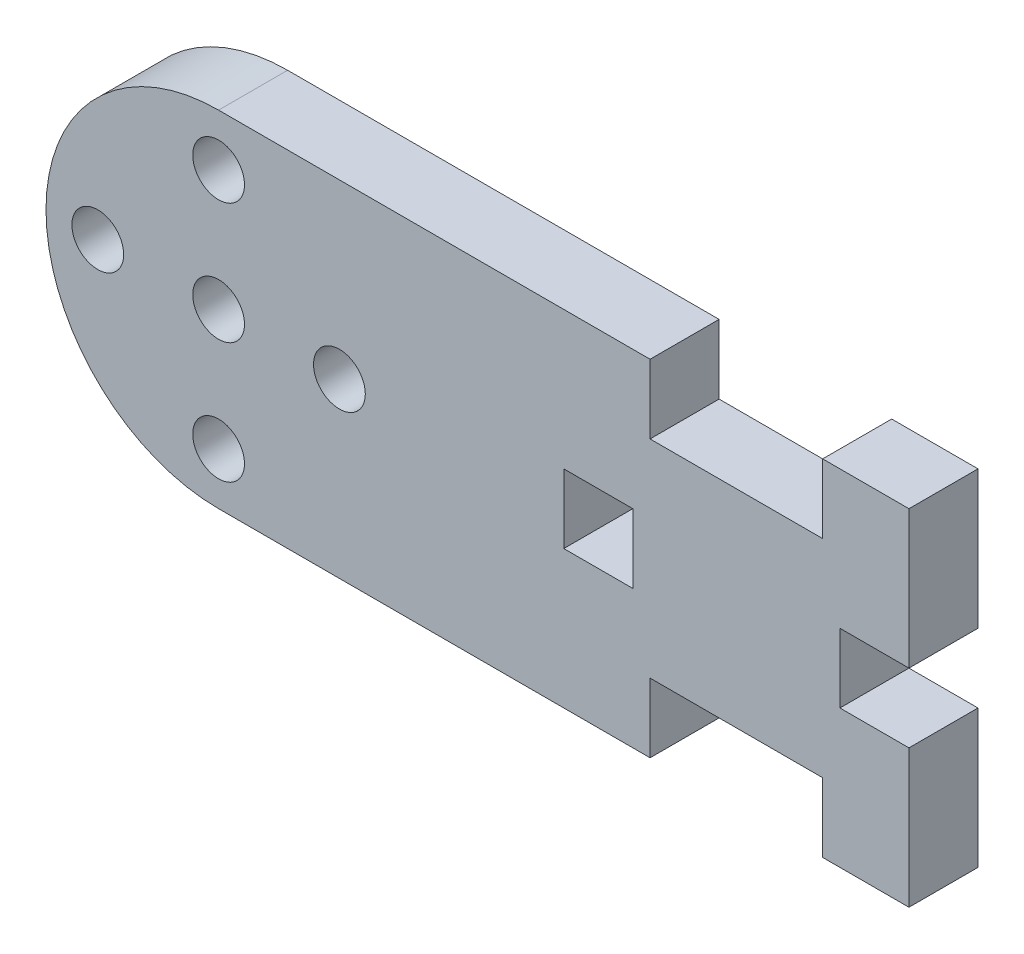
ISO-10303-21;
HEADER;
FILE_DESCRIPTION(('STEP AP214'),'2;1');
FILE_NAME('part.step','',(''),(''),'','','');
FILE_SCHEMA(('AUTOMOTIVE_DESIGN { 1 0 10303 214 1 1 1 1 }'));
ENDSEC;
DATA;
#1=APPLICATION_CONTEXT('core data for automotive mechanical design processes');
#2=APPLICATION_PROTOCOL_DEFINITION('international standard','automotive_design',2000,#1);
#3=PRODUCT_CONTEXT('',#1,'mechanical');
#4=PRODUCT('Part','Part','',(#3));
#5=PRODUCT_RELATED_PRODUCT_CATEGORY('part','',(#4));
#6=PRODUCT_DEFINITION_FORMATION('','',#4);
#7=PRODUCT_DEFINITION_CONTEXT('part definition',#1,'design');
#8=PRODUCT_DEFINITION('design','',#6,#7);
#9=PRODUCT_DEFINITION_SHAPE('','',#8);
#10=(LENGTH_UNIT() NAMED_UNIT(*) SI_UNIT(.MILLI.,.METRE.));
#11=(NAMED_UNIT(*) PLANE_ANGLE_UNIT() SI_UNIT($,.RADIAN.));
#12=(NAMED_UNIT(*) SI_UNIT($,.STERADIAN.) SOLID_ANGLE_UNIT());
#13=UNCERTAINTY_MEASURE_WITH_UNIT(LENGTH_MEASURE(1.E-05),#10,'distance_accuracy_value','');
#14=(GEOMETRIC_REPRESENTATION_CONTEXT(3) GLOBAL_UNCERTAINTY_ASSIGNED_CONTEXT((#13)) GLOBAL_UNIT_ASSIGNED_CONTEXT((#10,
#11,#12)) REPRESENTATION_CONTEXT('',''));
#15=CARTESIAN_POINT('',(0.,0.,0.));
#16=DIRECTION('',(0.,0.,1.));
#17=DIRECTION('',(1.,0.,0.));
#18=AXIS2_PLACEMENT_3D('',#15,#16,#17);
#19=CARTESIAN_POINT('',(0.,-10.,4.));
#20=DIRECTION('',(0.,1.,0.));
#21=DIRECTION('',(0.,0.,1.));
#22=AXIS2_PLACEMENT_3D('',#19,#20,#21);
#23=PLANE('',#22);
#24=DIRECTION('',(1.,0.,0.));
#25=VECTOR('',#24,1.);
#26=CARTESIAN_POINT('',(0.,-10.,0.));
#27=LINE('',#26,#25);
#28=CARTESIAN_POINT('',(0.,-10.,0.));
#29=VERTEX_POINT('',#28);
#30=CARTESIAN_POINT('',(24.9999999999998,-10.,0.));
#31=VERTEX_POINT('',#30);
#32=EDGE_CURVE('E413',#29,#31,#27,.T.);
#33=ORIENTED_EDGE('',*,*,#32,.T.);
#34=DIRECTION('',(0.,0.,1.));
#35=VECTOR('',#34,1.);
#36=CARTESIAN_POINT('',(24.9999999999998,-10.,4.));
#37=LINE('',#36,#35);
#38=CARTESIAN_POINT('',(24.9999999999998,-10.,4.));
#39=VERTEX_POINT('',#38);
#40=EDGE_CURVE('E441',#31,#39,#37,.T.);
#41=ORIENTED_EDGE('',*,*,#40,.T.);
#42=DIRECTION('',(1.,0.,0.));
#43=VECTOR('',#42,1.);
#44=CARTESIAN_POINT('',(0.,-10.,4.));
#45=LINE('',#44,#43);
#46=CARTESIAN_POINT('',(0.,-10.,4.));
#47=VERTEX_POINT('',#46);
#48=EDGE_CURVE('E311',#47,#39,#45,.T.);
#49=ORIENTED_EDGE('',*,*,#48,.F.);
#50=DIRECTION('',(0.,0.,-1.));
#51=VECTOR('',#50,1.);
#52=CARTESIAN_POINT('',(0.,-10.,4.));
#53=LINE('',#52,#51);
#54=EDGE_CURVE('E419',#47,#29,#53,.T.);
#55=ORIENTED_EDGE('',*,*,#54,.T.);
#56=EDGE_LOOP('',(#33,#41,#49,#55));
#57=FACE_BOUND('',#56,.T.);
#58=ADVANCED_FACE('F42',(#57),#23,.F.);
#59=CARTESIAN_POINT('',(0.,10.,4.));
#60=DIRECTION('',(0.,-1.,0.));
#61=DIRECTION('',(0.,0.,-1.));
#62=AXIS2_PLACEMENT_3D('',#59,#60,#61);
#63=PLANE('',#62);
#64=DIRECTION('',(-1.,0.,0.));
#65=VECTOR('',#64,1.);
#66=CARTESIAN_POINT('',(0.,10.,4.));
#67=LINE('',#66,#65);
#68=CARTESIAN_POINT('',(25.,10.,4.));
#69=VERTEX_POINT('',#68);
#70=CARTESIAN_POINT('',(0.,10.,4.));
#71=VERTEX_POINT('',#70);
#72=EDGE_CURVE('E305',#69,#71,#67,.T.);
#73=ORIENTED_EDGE('',*,*,#72,.F.);
#74=DIRECTION('',(0.,0.,-1.));
#75=VECTOR('',#74,1.);
#76=CARTESIAN_POINT('',(25.,10.,4.));
#77=LINE('',#76,#75);
#78=CARTESIAN_POINT('',(25.,10.,0.));
#79=VERTEX_POINT('',#78);
#80=EDGE_CURVE('E426',#69,#79,#77,.T.);
#81=ORIENTED_EDGE('',*,*,#80,.T.);
#82=DIRECTION('',(-1.,0.,0.));
#83=VECTOR('',#82,1.);
#84=CARTESIAN_POINT('',(0.,10.,0.));
#85=LINE('',#84,#83);
#86=CARTESIAN_POINT('',(0.,10.,0.));
#87=VERTEX_POINT('',#86);
#88=EDGE_CURVE('E406',#79,#87,#85,.T.);
#89=ORIENTED_EDGE('',*,*,#88,.T.);
#90=DIRECTION('',(0.,0.,-1.));
#91=VECTOR('',#90,1.);
#92=CARTESIAN_POINT('',(0.,10.,4.));
#93=LINE('',#92,#91);
#94=EDGE_CURVE('E415',#71,#87,#93,.T.);
#95=ORIENTED_EDGE('',*,*,#94,.F.);
#96=EDGE_LOOP('',(#73,#81,#89,#95));
#97=FACE_BOUND('',#96,.T.);
#98=ADVANCED_FACE('F536',(#97),#63,.F.);
#99=CARTESIAN_POINT('',(0.,0.,4.));
#100=DIRECTION('',(0.,0.,1.));
#101=DIRECTION('',(1.,0.,0.));
#102=AXIS2_PLACEMENT_3D('',#99,#100,#101);
#103=PLANE('',#102);
#104=DIRECTION('',(1.,0.,0.));
#105=VECTOR('',#104,1.);
#106=CARTESIAN_POINT('',(24.,-1.99999999999999,4.));
#107=LINE('',#106,#105);
#108=CARTESIAN_POINT('',(20.,-1.99999999999999,4.));
#109=VERTEX_POINT('',#108);
#110=CARTESIAN_POINT('',(24.,-1.99999999999999,4.));
#111=VERTEX_POINT('',#110);
#112=EDGE_CURVE('E58',#109,#111,#107,.T.);
#113=ORIENTED_EDGE('',*,*,#112,.F.);
#114=DIRECTION('',(0.,-1.,0.));
#115=VECTOR('',#114,1.);
#116=CARTESIAN_POINT('',(20.,-1.99999999999999,4.));
#117=LINE('',#116,#115);
#118=CARTESIAN_POINT('',(20.,1.99999999999999,4.));
#119=VERTEX_POINT('',#118);
#120=EDGE_CURVE('E273',#119,#109,#117,.T.);
#121=ORIENTED_EDGE('',*,*,#120,.F.);
#122=DIRECTION('',(-1.,0.,0.));
#123=VECTOR('',#122,1.);
#124=CARTESIAN_POINT('',(20.,1.99999999999999,4.));
#125=LINE('',#124,#123);
#126=CARTESIAN_POINT('',(24.,2.,4.));
#127=VERTEX_POINT('',#126);
#128=EDGE_CURVE('E279',#127,#119,#125,.T.);
#129=ORIENTED_EDGE('',*,*,#128,.F.);
#130=DIRECTION('',(0.,1.,0.));
#131=VECTOR('',#130,1.);
#132=CARTESIAN_POINT('',(24.,2.,4.));
#133=LINE('',#132,#131);
#134=EDGE_CURVE('E267',#111,#127,#133,.T.);
#135=ORIENTED_EDGE('',*,*,#134,.F.);
#136=EDGE_LOOP('',(#113,#121,#129,#135));
#137=FACE_BOUND('',#136,.T.);
#138=DIRECTION('',(0.,-1.,0.));
#139=VECTOR('',#138,1.);
#140=CARTESIAN_POINT('',(24.9999999999998,-10.,4.));
#141=LINE('',#140,#139);
#142=CARTESIAN_POINT('',(24.9999999999998,-6.00000000000012,4.));
#143=VERTEX_POINT('',#142);
#144=EDGE_CURVE('E241',#143,#39,#141,.T.);
#145=ORIENTED_EDGE('',*,*,#144,.F.);
#146=DIRECTION('',(-1.,0.,0.));
#147=VECTOR('',#146,1.);
#148=CARTESIAN_POINT('',(24.9999999999998,-6.00000000000012,4.));
#149=LINE('',#148,#147);
#150=CARTESIAN_POINT('',(34.9999999999998,-6.00000000000012,4.));
#151=VERTEX_POINT('',#150);
#152=EDGE_CURVE('E255',#151,#143,#149,.T.);
#153=ORIENTED_EDGE('',*,*,#152,.F.);
#154=DIRECTION('',(0.,1.,0.));
#155=VECTOR('',#154,1.);
#156=CARTESIAN_POINT('',(34.9999999999998,-6.00000000000012,4.));
#157=LINE('',#156,#155);
#158=CARTESIAN_POINT('',(34.9999999999999,-10.,4.));
#159=VERTEX_POINT('',#158);
#160=EDGE_CURVE('E245',#159,#151,#157,.T.);
#161=ORIENTED_EDGE('',*,*,#160,.F.);
#162=CARTESIAN_POINT('',(39.9999999999999,-10.,4.));
#163=VERTEX_POINT('',#162);
#164=EDGE_CURVE('E398',#159,#163,#45,.T.);
#165=ORIENTED_EDGE('',*,*,#164,.T.);
#166=DIRECTION('',(0.,-1.,0.));
#167=VECTOR('',#166,1.);
#168=CARTESIAN_POINT('',(39.9999999999999,-18.4879479237546,4.));
#169=LINE('',#168,#167);
#170=CARTESIAN_POINT('',(39.9999999999999,-1.99999999999999,4.));
#171=VERTEX_POINT('',#170);
#172=EDGE_CURVE('E211',#171,#163,#169,.T.);
#173=ORIENTED_EDGE('',*,*,#172,.F.);
#174=DIRECTION('',(1.,0.,0.));
#175=VECTOR('',#174,1.);
#176=CARTESIAN_POINT('',(35.9999999999999,-1.99999999999999,4.));
#177=LINE('',#176,#175);
#178=CARTESIAN_POINT('',(35.9999999999999,-1.99999999999999,4.));
#179=VERTEX_POINT('',#178);
#180=EDGE_CURVE('E186',#179,#171,#177,.T.);
#181=ORIENTED_EDGE('',*,*,#180,.F.);
#182=DIRECTION('',(0.,-1.,0.));
#183=VECTOR('',#182,1.);
#184=CARTESIAN_POINT('',(35.9999999999999,2.,4.));
#185=LINE('',#184,#183);
#186=CARTESIAN_POINT('',(35.9999999999999,2.,4.));
#187=VERTEX_POINT('',#186);
#188=EDGE_CURVE('E197',#187,#179,#185,.T.);
#189=ORIENTED_EDGE('',*,*,#188,.F.);
#190=DIRECTION('',(-1.,0.,0.));
#191=VECTOR('',#190,1.);
#192=CARTESIAN_POINT('',(39.9999999999999,1.99999999999999,4.));
#193=LINE('',#192,#191);
#194=CARTESIAN_POINT('',(39.9999999999999,1.99999999999999,4.));
#195=VERTEX_POINT('',#194);
#196=EDGE_CURVE('E194',#195,#187,#193,.T.);
#197=ORIENTED_EDGE('',*,*,#196,.F.);
#198=DIRECTION('',(0.,-1.,0.));
#199=VECTOR('',#198,1.);
#200=CARTESIAN_POINT('',(39.9999999999999,1.99999999999999,4.));
#201=LINE('',#200,#199);
#202=CARTESIAN_POINT('',(39.9999999999999,10.,4.));
#203=VERTEX_POINT('',#202);
#204=EDGE_CURVE('E215',#203,#195,#201,.T.);
#205=ORIENTED_EDGE('',*,*,#204,.F.);
#206=CARTESIAN_POINT('',(35.,10.,4.));
#207=VERTEX_POINT('',#206);
#208=EDGE_CURVE('E310',#203,#207,#67,.T.);
#209=ORIENTED_EDGE('',*,*,#208,.T.);
#210=DIRECTION('',(0.,1.,0.));
#211=VECTOR('',#210,1.);
#212=CARTESIAN_POINT('',(35.,6.00000000000001,4.));
#213=LINE('',#212,#211);
#214=CARTESIAN_POINT('',(35.,6.00000000000001,4.));
#215=VERTEX_POINT('',#214);
#216=EDGE_CURVE('E316',#215,#207,#213,.T.);
#217=ORIENTED_EDGE('',*,*,#216,.F.);
#218=DIRECTION('',(1.,0.,0.));
#219=VECTOR('',#218,1.);
#220=CARTESIAN_POINT('',(25.,6.00000000000001,4.));
#221=LINE('',#220,#219);
#222=CARTESIAN_POINT('',(25.,6.00000000000001,4.));
#223=VERTEX_POINT('',#222);
#224=EDGE_CURVE('E294',#223,#215,#221,.T.);
#225=ORIENTED_EDGE('',*,*,#224,.F.);
#226=DIRECTION('',(0.,-1.,0.));
#227=VECTOR('',#226,1.);
#228=CARTESIAN_POINT('',(25.,10.,4.));
#229=LINE('',#228,#227);
#230=EDGE_CURVE('E235',#69,#223,#229,.T.);
#231=ORIENTED_EDGE('',*,*,#230,.F.);
#232=ORIENTED_EDGE('',*,*,#72,.T.);
#233=CARTESIAN_POINT('',(0.,0.,4.));
#234=DIRECTION('',(0.,0.,1.));
#235=DIRECTION('',(1.,0.,0.));
#236=AXIS2_PLACEMENT_3D('',#233,#234,#235);
#237=CIRCLE('',#236,10.);
#238=EDGE_CURVE('E394',#71,#47,#237,.T.);
#239=ORIENTED_EDGE('',*,*,#238,.T.);
#240=ORIENTED_EDGE('',*,*,#48,.T.);
#241=EDGE_LOOP('',(#145,#153,#161,#165,#173,#181,#189,#197,#205,#209,#217,#225,#231,#232,#239,#240));
#242=FACE_BOUND('',#241,.T.);
#243=CARTESIAN_POINT('',(0.,-7.,4.));
#244=DIRECTION('',(0.,0.,1.));
#245=DIRECTION('',(1.,0.,0.));
#246=AXIS2_PLACEMENT_3D('',#243,#244,#245);
#247=CIRCLE('',#246,1.5);
#248=CARTESIAN_POINT('',(1.5,-7.,4.));
#249=VERTEX_POINT('',#248);
#250=EDGE_CURVE('E359',#249,#249,#247,.T.);
#251=ORIENTED_EDGE('',*,*,#250,.F.);
#252=EDGE_LOOP('',(#251));
#253=FACE_BOUND('',#252,.T.);
#254=CARTESIAN_POINT('',(7.,0.,4.));
#255=DIRECTION('',(0.,0.,1.));
#256=DIRECTION('',(1.,0.,0.));
#257=AXIS2_PLACEMENT_3D('',#254,#255,#256);
#258=CIRCLE('',#257,1.5);
#259=CARTESIAN_POINT('',(8.5,0.,4.));
#260=VERTEX_POINT('',#259);
#261=EDGE_CURVE('E370',#260,#260,#258,.T.);
#262=ORIENTED_EDGE('',*,*,#261,.F.);
#263=EDGE_LOOP('',(#262));
#264=FACE_BOUND('',#263,.T.);
#265=CARTESIAN_POINT('',(0.,7.,4.));
#266=DIRECTION('',(0.,0.,1.));
#267=DIRECTION('',(1.,0.,0.));
#268=AXIS2_PLACEMENT_3D('',#265,#266,#267);
#269=CIRCLE('',#268,1.5);
#270=CARTESIAN_POINT('',(1.5,7.,4.));
#271=VERTEX_POINT('',#270);
#272=EDGE_CURVE('E378',#271,#271,#269,.T.);
#273=ORIENTED_EDGE('',*,*,#272,.F.);
#274=EDGE_LOOP('',(#273));
#275=FACE_BOUND('',#274,.T.);
#276=CARTESIAN_POINT('',(0.,0.,4.));
#277=DIRECTION('',(0.,0.,1.));
#278=DIRECTION('',(1.,0.,0.));
#279=AXIS2_PLACEMENT_3D('',#276,#277,#278);
#280=CIRCLE('',#279,1.5);
#281=CARTESIAN_POINT('',(1.5,0.,4.));
#282=VERTEX_POINT('',#281);
#283=EDGE_CURVE('E387',#282,#282,#280,.T.);
#284=ORIENTED_EDGE('',*,*,#283,.F.);
#285=EDGE_LOOP('',(#284));
#286=FACE_BOUND('',#285,.T.);
#287=CARTESIAN_POINT('',(-7.,0.,4.));
#288=DIRECTION('',(0.,0.,1.));
#289=DIRECTION('',(1.,0.,0.));
#290=AXIS2_PLACEMENT_3D('',#287,#288,#289);
#291=CIRCLE('',#290,1.5);
#292=CARTESIAN_POINT('',(-5.5,0.,4.));
#293=VERTEX_POINT('',#292);
#294=EDGE_CURVE('E350',#293,#293,#291,.T.);
#295=ORIENTED_EDGE('',*,*,#294,.F.);
#296=EDGE_LOOP('',(#295));
#297=FACE_BOUND('',#296,.T.);
#298=ADVANCED_FACE('F208',(#137,#242,#253,#264,#275,#286,#297),#103,.T.);
#299=CARTESIAN_POINT('',(0.,0.,0.));
#300=DIRECTION('',(0.,0.,1.));
#301=DIRECTION('',(1.,0.,0.));
#302=AXIS2_PLACEMENT_3D('',#299,#300,#301);
#303=PLANE('',#302);
#304=DIRECTION('',(0.,-1.,0.));
#305=VECTOR('',#304,1.);
#306=CARTESIAN_POINT('',(20.,0.,0.));
#307=LINE('',#306,#305);
#308=CARTESIAN_POINT('',(20.,1.99999999999999,0.));
#309=VERTEX_POINT('',#308);
#310=CARTESIAN_POINT('',(20.,-1.99999999999999,0.));
#311=VERTEX_POINT('',#310);
#312=EDGE_CURVE('E51',#309,#311,#307,.T.);
#313=ORIENTED_EDGE('',*,*,#312,.T.);
#314=DIRECTION('',(1.,0.,0.));
#315=VECTOR('',#314,1.);
#316=CARTESIAN_POINT('',(0.,-2.,0.));
#317=LINE('',#316,#315);
#318=CARTESIAN_POINT('',(24.,-1.99999999999999,0.));
#319=VERTEX_POINT('',#318);
#320=EDGE_CURVE('E12',#311,#319,#317,.T.);
#321=ORIENTED_EDGE('',*,*,#320,.T.);
#322=DIRECTION('',(0.,1.,0.));
#323=VECTOR('',#322,1.);
#324=CARTESIAN_POINT('',(24.,0.,0.));
#325=LINE('',#324,#323);
#326=CARTESIAN_POINT('',(24.,2.,0.));
#327=VERTEX_POINT('',#326);
#328=EDGE_CURVE('E462',#319,#327,#325,.T.);
#329=ORIENTED_EDGE('',*,*,#328,.T.);
#330=DIRECTION('',(-1.,0.,0.));
#331=VECTOR('',#330,1.);
#332=CARTESIAN_POINT('',(0.,1.99999999999999,0.));
#333=LINE('',#332,#331);
#334=EDGE_CURVE('E466',#327,#309,#333,.T.);
#335=ORIENTED_EDGE('',*,*,#334,.T.);
#336=EDGE_LOOP('',(#313,#321,#329,#335));
#337=FACE_BOUND('',#336,.T.);
#338=DIRECTION('',(-1.,0.,0.));
#339=VECTOR('',#338,1.);
#340=CARTESIAN_POINT('',(0.,-6.00000000000012,0.));
#341=LINE('',#340,#339);
#342=CARTESIAN_POINT('',(34.9999999999998,-6.00000000000012,0.));
#343=VERTEX_POINT('',#342);
#344=CARTESIAN_POINT('',(24.9999999999998,-6.00000000000012,0.));
#345=VERTEX_POINT('',#344);
#346=EDGE_CURVE('E458',#343,#345,#341,.T.);
#347=ORIENTED_EDGE('',*,*,#346,.T.);
#348=DIRECTION('',(0.,-1.,0.));
#349=VECTOR('',#348,1.);
#350=CARTESIAN_POINT('',(24.9999999999998,0.,0.));
#351=LINE('',#350,#349);
#352=EDGE_CURVE('E346',#345,#31,#351,.T.);
#353=ORIENTED_EDGE('',*,*,#352,.T.);
#354=ORIENTED_EDGE('',*,*,#32,.F.);
#355=CARTESIAN_POINT('',(0.,0.,0.));
#356=DIRECTION('',(0.,0.,1.));
#357=DIRECTION('',(1.,0.,0.));
#358=AXIS2_PLACEMENT_3D('',#355,#356,#357);
#359=CIRCLE('',#358,10.);
#360=EDGE_CURVE('E313',#87,#29,#359,.T.);
#361=ORIENTED_EDGE('',*,*,#360,.F.);
#362=ORIENTED_EDGE('',*,*,#88,.F.);
#363=DIRECTION('',(0.,-1.,0.));
#364=VECTOR('',#363,1.);
#365=CARTESIAN_POINT('',(25.,0.,0.));
#366=LINE('',#365,#364);
#367=CARTESIAN_POINT('',(25.,6.00000000000001,0.));
#368=VERTEX_POINT('',#367);
#369=EDGE_CURVE('E330',#79,#368,#366,.T.);
#370=ORIENTED_EDGE('',*,*,#369,.T.);
#371=DIRECTION('',(1.,0.,0.));
#372=VECTOR('',#371,1.);
#373=CARTESIAN_POINT('',(0.,6.,0.));
#374=LINE('',#373,#372);
#375=CARTESIAN_POINT('',(35.,6.00000000000001,0.));
#376=VERTEX_POINT('',#375);
#377=EDGE_CURVE('E445',#368,#376,#374,.T.);
#378=ORIENTED_EDGE('',*,*,#377,.T.);
#379=DIRECTION('',(0.,1.,0.));
#380=VECTOR('',#379,1.);
#381=CARTESIAN_POINT('',(35.,0.,0.));
#382=LINE('',#381,#380);
#383=CARTESIAN_POINT('',(35.,10.,0.));
#384=VERTEX_POINT('',#383);
#385=EDGE_CURVE('E324',#376,#384,#382,.T.);
#386=ORIENTED_EDGE('',*,*,#385,.T.);
#387=CARTESIAN_POINT('',(39.9999999999999,10.,0.));
#388=VERTEX_POINT('',#387);
#389=EDGE_CURVE('E399',#388,#384,#85,.T.);
#390=ORIENTED_EDGE('',*,*,#389,.F.);
#391=DIRECTION('',(0.,-1.,0.));
#392=VECTOR('',#391,1.);
#393=CARTESIAN_POINT('',(39.9999999999999,0.,0.));
#394=LINE('',#393,#392);
#395=CARTESIAN_POINT('',(39.9999999999999,1.99999999999999,0.));
#396=VERTEX_POINT('',#395);
#397=EDGE_CURVE('E334',#388,#396,#394,.T.);
#398=ORIENTED_EDGE('',*,*,#397,.T.);
#399=DIRECTION('',(-1.,0.,0.));
#400=VECTOR('',#399,1.);
#401=CARTESIAN_POINT('',(0.,2.00000000000001,0.));
#402=LINE('',#401,#400);
#403=CARTESIAN_POINT('',(35.9999999999999,2.,0.));
#404=VERTEX_POINT('',#403);
#405=EDGE_CURVE('E454',#396,#404,#402,.T.);
#406=ORIENTED_EDGE('',*,*,#405,.T.);
#407=DIRECTION('',(0.,-1.,0.));
#408=VECTOR('',#407,1.);
#409=CARTESIAN_POINT('',(35.9999999999999,0.,0.));
#410=LINE('',#409,#408);
#411=CARTESIAN_POINT('',(35.9999999999999,-1.99999999999999,0.));
#412=VERTEX_POINT('',#411);
#413=EDGE_CURVE('E451',#404,#412,#410,.T.);
#414=ORIENTED_EDGE('',*,*,#413,.T.);
#415=DIRECTION('',(1.,0.,0.));
#416=VECTOR('',#415,1.);
#417=CARTESIAN_POINT('',(0.,-1.99999999999998,0.));
#418=LINE('',#417,#416);
#419=CARTESIAN_POINT('',(39.9999999999999,-1.99999999999999,0.));
#420=VERTEX_POINT('',#419);
#421=EDGE_CURVE('E189',#412,#420,#418,.T.);
#422=ORIENTED_EDGE('',*,*,#421,.T.);
#423=DIRECTION('',(0.,-1.,0.));
#424=VECTOR('',#423,1.);
#425=CARTESIAN_POINT('',(39.9999999999999,0.,0.));
#426=LINE('',#425,#424);
#427=CARTESIAN_POINT('',(39.9999999999999,-10.,0.));
#428=VERTEX_POINT('',#427);
#429=EDGE_CURVE('E338',#420,#428,#426,.T.);
#430=ORIENTED_EDGE('',*,*,#429,.T.);
#431=CARTESIAN_POINT('',(34.9999999999999,-10.,0.));
#432=VERTEX_POINT('',#431);
#433=EDGE_CURVE('E502',#432,#428,#27,.T.);
#434=ORIENTED_EDGE('',*,*,#433,.F.);
#435=DIRECTION('',(0.,1.,0.));
#436=VECTOR('',#435,1.);
#437=CARTESIAN_POINT('',(34.9999999999998,0.,0.));
#438=LINE('',#437,#436);
#439=EDGE_CURVE('E342',#432,#343,#438,.T.);
#440=ORIENTED_EDGE('',*,*,#439,.T.);
#441=EDGE_LOOP('',(#347,#353,#354,#361,#362,#370,#378,#386,#390,#398,#406,#414,#422,#430,#434,#440));
#442=FACE_BOUND('',#441,.T.);
#443=CARTESIAN_POINT('',(0.,0.,0.));
#444=DIRECTION('',(0.,0.,1.));
#445=DIRECTION('',(1.,0.,0.));
#446=AXIS2_PLACEMENT_3D('',#443,#444,#445);
#447=CIRCLE('',#446,1.5);
#448=CARTESIAN_POINT('',(1.5,0.,0.));
#449=VERTEX_POINT('',#448);
#450=EDGE_CURVE('E383',#449,#449,#447,.T.);
#451=ORIENTED_EDGE('',*,*,#450,.T.);
#452=EDGE_LOOP('',(#451));
#453=FACE_BOUND('',#452,.T.);
#454=CARTESIAN_POINT('',(0.,7.,0.));
#455=DIRECTION('',(0.,0.,1.));
#456=DIRECTION('',(1.,0.,0.));
#457=AXIS2_PLACEMENT_3D('',#454,#455,#456);
#458=CIRCLE('',#457,1.5);
#459=CARTESIAN_POINT('',(1.5,7.,0.));
#460=VERTEX_POINT('',#459);
#461=EDGE_CURVE('E375',#460,#460,#458,.T.);
#462=ORIENTED_EDGE('',*,*,#461,.T.);
#463=EDGE_LOOP('',(#462));
#464=FACE_BOUND('',#463,.T.);
#465=CARTESIAN_POINT('',(7.,0.,0.));
#466=DIRECTION('',(0.,0.,1.));
#467=DIRECTION('',(1.,0.,0.));
#468=AXIS2_PLACEMENT_3D('',#465,#466,#467);
#469=CIRCLE('',#468,1.5);
#470=CARTESIAN_POINT('',(8.5,0.,0.));
#471=VERTEX_POINT('',#470);
#472=EDGE_CURVE('E364',#471,#471,#469,.T.);
#473=ORIENTED_EDGE('',*,*,#472,.T.);
#474=EDGE_LOOP('',(#473));
#475=FACE_BOUND('',#474,.T.);
#476=CARTESIAN_POINT('',(0.,-7.,0.));
#477=DIRECTION('',(0.,0.,1.));
#478=DIRECTION('',(1.,0.,0.));
#479=AXIS2_PLACEMENT_3D('',#476,#477,#478);
#480=CIRCLE('',#479,1.5);
#481=CARTESIAN_POINT('',(1.5,-7.,0.));
#482=VERTEX_POINT('',#481);
#483=EDGE_CURVE('E355',#482,#482,#480,.T.);
#484=ORIENTED_EDGE('',*,*,#483,.T.);
#485=EDGE_LOOP('',(#484));
#486=FACE_BOUND('',#485,.T.);
#487=CARTESIAN_POINT('',(-7.,0.,0.));
#488=DIRECTION('',(0.,0.,1.));
#489=DIRECTION('',(1.,0.,0.));
#490=AXIS2_PLACEMENT_3D('',#487,#488,#489);
#491=CIRCLE('',#490,1.5);
#492=CARTESIAN_POINT('',(-5.5,0.,0.));
#493=VERTEX_POINT('',#492);
#494=EDGE_CURVE('E349',#493,#493,#491,.T.);
#495=ORIENTED_EDGE('',*,*,#494,.T.);
#496=EDGE_LOOP('',(#495));
#497=FACE_BOUND('',#496,.T.);
#498=ADVANCED_FACE('F472',(#337,#442,#453,#464,#475,#486,#497),#303,.F.);
#499=CARTESIAN_POINT('',(0.,0.,4.));
#500=DIRECTION('',(0.,0.,-1.));
#501=DIRECTION('',(-1.,0.,0.));
#502=AXIS2_PLACEMENT_3D('',#499,#500,#501);
#503=CYLINDRICAL_SURFACE('',#502,10.);
#504=ORIENTED_EDGE('',*,*,#360,.T.);
#505=ORIENTED_EDGE('',*,*,#54,.F.);
#506=ORIENTED_EDGE('',*,*,#238,.F.);
#507=ORIENTED_EDGE('',*,*,#94,.T.);
#508=EDGE_LOOP('',(#504,#505,#506,#507));
#509=FACE_BOUND('',#508,.T.);
#510=ADVANCED_FACE('F44',(#509),#503,.T.);
#511=ORIENTED_EDGE('',*,*,#164,.F.);
#512=DIRECTION('',(0.,0.,-1.));
#513=VECTOR('',#512,1.);
#514=CARTESIAN_POINT('',(34.9999999999999,-10.,4.));
#515=LINE('',#514,#513);
#516=EDGE_CURVE('E437',#159,#432,#515,.T.);
#517=ORIENTED_EDGE('',*,*,#516,.T.);
#518=ORIENTED_EDGE('',*,*,#433,.T.);
#519=DIRECTION('',(0.,0.,1.));
#520=VECTOR('',#519,1.);
#521=CARTESIAN_POINT('',(39.9999999999999,-10.,4.));
#522=LINE('',#521,#520);
#523=EDGE_CURVE('E433',#428,#163,#522,.T.);
#524=ORIENTED_EDGE('',*,*,#523,.T.);
#525=EDGE_LOOP('',(#511,#517,#518,#524));
#526=FACE_BOUND('',#525,.T.);
#527=ADVANCED_FACE('F504',(#526),#23,.F.);
#528=ORIENTED_EDGE('',*,*,#208,.F.);
#529=DIRECTION('',(0.,0.,-1.));
#530=VECTOR('',#529,1.);
#531=CARTESIAN_POINT('',(39.9999999999999,10.,4.));
#532=LINE('',#531,#530);
#533=EDGE_CURVE('E430',#203,#388,#532,.T.);
#534=ORIENTED_EDGE('',*,*,#533,.T.);
#535=ORIENTED_EDGE('',*,*,#389,.T.);
#536=DIRECTION('',(0.,0.,1.));
#537=VECTOR('',#536,1.);
#538=CARTESIAN_POINT('',(35.,10.,4.));
#539=LINE('',#538,#537);
#540=EDGE_CURVE('E423',#384,#207,#539,.T.);
#541=ORIENTED_EDGE('',*,*,#540,.T.);
#542=EDGE_LOOP('',(#528,#534,#535,#541));
#543=FACE_BOUND('',#542,.T.);
#544=ADVANCED_FACE('F517',(#543),#63,.F.);
#545=CARTESIAN_POINT('',(0.,0.,4.));
#546=DIRECTION('',(0.,0.,-1.));
#547=DIRECTION('',(-1.,0.,0.));
#548=AXIS2_PLACEMENT_3D('',#545,#546,#547);
#549=CYLINDRICAL_SURFACE('',#548,1.5);
#550=ORIENTED_EDGE('',*,*,#283,.T.);
#551=EDGE_LOOP('',(#550));
#552=FACE_BOUND('',#551,.T.);
#553=ORIENTED_EDGE('',*,*,#450,.F.);
#554=EDGE_LOOP('',(#553));
#555=FACE_BOUND('',#554,.T.);
#556=ADVANCED_FACE('F547',(#552,#555),#549,.F.);
#557=CARTESIAN_POINT('',(0.,7.,4.));
#558=DIRECTION('',(0.,0.,-1.));
#559=DIRECTION('',(-1.,0.,0.));
#560=AXIS2_PLACEMENT_3D('',#557,#558,#559);
#561=CYLINDRICAL_SURFACE('',#560,1.5);
#562=ORIENTED_EDGE('',*,*,#272,.T.);
#563=EDGE_LOOP('',(#562));
#564=FACE_BOUND('',#563,.T.);
#565=ORIENTED_EDGE('',*,*,#461,.F.);
#566=EDGE_LOOP('',(#565));
#567=FACE_BOUND('',#566,.T.);
#568=ADVANCED_FACE('F594',(#564,#567),#561,.F.);
#569=CARTESIAN_POINT('',(7.,0.,4.));
#570=DIRECTION('',(0.,0.,-1.));
#571=DIRECTION('',(-1.,0.,0.));
#572=AXIS2_PLACEMENT_3D('',#569,#570,#571);
#573=CYLINDRICAL_SURFACE('',#572,1.5);
#574=ORIENTED_EDGE('',*,*,#261,.T.);
#575=EDGE_LOOP('',(#574));
#576=FACE_BOUND('',#575,.T.);
#577=ORIENTED_EDGE('',*,*,#472,.F.);
#578=EDGE_LOOP('',(#577));
#579=FACE_BOUND('',#578,.T.);
#580=ADVANCED_FACE('F590',(#576,#579),#573,.F.);
#581=CARTESIAN_POINT('',(0.,-7.,4.));
#582=DIRECTION('',(0.,0.,-1.));
#583=DIRECTION('',(-1.,0.,0.));
#584=AXIS2_PLACEMENT_3D('',#581,#582,#583);
#585=CYLINDRICAL_SURFACE('',#584,1.5);
#586=ORIENTED_EDGE('',*,*,#250,.T.);
#587=EDGE_LOOP('',(#586));
#588=FACE_BOUND('',#587,.T.);
#589=ORIENTED_EDGE('',*,*,#483,.F.);
#590=EDGE_LOOP('',(#589));
#591=FACE_BOUND('',#590,.T.);
#592=ADVANCED_FACE('F586',(#588,#591),#585,.F.);
#593=CARTESIAN_POINT('',(-7.,0.,4.));
#594=DIRECTION('',(0.,0.,-1.));
#595=DIRECTION('',(-1.,0.,0.));
#596=AXIS2_PLACEMENT_3D('',#593,#594,#595);
#597=CYLINDRICAL_SURFACE('',#596,1.5);
#598=ORIENTED_EDGE('',*,*,#294,.T.);
#599=EDGE_LOOP('',(#598));
#600=FACE_BOUND('',#599,.T.);
#601=ORIENTED_EDGE('',*,*,#494,.F.);
#602=EDGE_LOOP('',(#601));
#603=FACE_BOUND('',#602,.T.);
#604=ADVANCED_FACE('F581',(#600,#603),#597,.F.);
#605=CARTESIAN_POINT('',(25.,6.00000000000001,-6.));
#606=DIRECTION('',(0.,-1.,0.));
#607=DIRECTION('',(1.,0.,0.));
#608=AXIS2_PLACEMENT_3D('',#605,#606,#607);
#609=PLANE('',#608);
#610=DIRECTION('',(0.,0.,1.));
#611=VECTOR('',#610,1.);
#612=CARTESIAN_POINT('',(25.,6.00000000000001,-6.));
#613=LINE('',#612,#611);
#614=EDGE_CURVE('E320',#368,#223,#613,.T.);
#615=ORIENTED_EDGE('',*,*,#614,.T.);
#616=ORIENTED_EDGE('',*,*,#224,.T.);
#617=DIRECTION('',(0.,0.,1.));
#618=VECTOR('',#617,1.);
#619=CARTESIAN_POINT('',(35.,6.00000000000001,-6.));
#620=LINE('',#619,#618);
#621=EDGE_CURVE('E321',#376,#215,#620,.T.);
#622=ORIENTED_EDGE('',*,*,#621,.F.);
#623=ORIENTED_EDGE('',*,*,#377,.F.);
#624=EDGE_LOOP('',(#615,#616,#622,#623));
#625=FACE_BOUND('',#624,.T.);
#626=ADVANCED_FACE('F566',(#625),#609,.F.);
#627=CARTESIAN_POINT('',(25.,10.,-6.));
#628=DIRECTION('',(-1.,0.,0.));
#629=DIRECTION('',(0.,0.,1.));
#630=AXIS2_PLACEMENT_3D('',#627,#628,#629);
#631=PLANE('',#630);
#632=ORIENTED_EDGE('',*,*,#80,.F.);
#633=ORIENTED_EDGE('',*,*,#230,.T.);
#634=ORIENTED_EDGE('',*,*,#614,.F.);
#635=ORIENTED_EDGE('',*,*,#369,.F.);
#636=EDGE_LOOP('',(#632,#633,#634,#635));
#637=FACE_BOUND('',#636,.T.);
#638=ADVANCED_FACE('F572',(#637),#631,.F.);
#639=CARTESIAN_POINT('',(35.,6.00000000000001,-6.));
#640=DIRECTION('',(1.,0.,0.));
#641=DIRECTION('',(0.,1.,0.));
#642=AXIS2_PLACEMENT_3D('',#639,#640,#641);
#643=PLANE('',#642);
#644=ORIENTED_EDGE('',*,*,#621,.T.);
#645=ORIENTED_EDGE('',*,*,#216,.T.);
#646=ORIENTED_EDGE('',*,*,#540,.F.);
#647=ORIENTED_EDGE('',*,*,#385,.F.);
#648=EDGE_LOOP('',(#644,#645,#646,#647));
#649=FACE_BOUND('',#648,.T.);
#650=ADVANCED_FACE('F570',(#649),#643,.F.);
#651=CARTESIAN_POINT('',(35.9999999999999,2.,-6.));
#652=DIRECTION('',(-1.,0.,0.));
#653=DIRECTION('',(0.,0.,1.));
#654=AXIS2_PLACEMENT_3D('',#651,#652,#653);
#655=PLANE('',#654);
#656=DIRECTION('',(0.,0.,1.));
#657=VECTOR('',#656,1.);
#658=CARTESIAN_POINT('',(35.9999999999999,2.,-6.));
#659=LINE('',#658,#657);
#660=EDGE_CURVE('E200',#404,#187,#659,.T.);
#661=ORIENTED_EDGE('',*,*,#660,.T.);
#662=ORIENTED_EDGE('',*,*,#188,.T.);
#663=DIRECTION('',(0.,0.,1.));
#664=VECTOR('',#663,1.);
#665=CARTESIAN_POINT('',(35.9999999999999,-1.99999999999999,-6.));
#666=LINE('',#665,#664);
#667=EDGE_CURVE('E181',#412,#179,#666,.T.);
#668=ORIENTED_EDGE('',*,*,#667,.F.);
#669=ORIENTED_EDGE('',*,*,#413,.F.);
#670=EDGE_LOOP('',(#661,#662,#668,#669));
#671=FACE_BOUND('',#670,.T.);
#672=ADVANCED_FACE('F198',(#671),#655,.F.);
#673=CARTESIAN_POINT('',(39.9999999999999,1.99999999999999,-6.));
#674=DIRECTION('',(0.,1.,0.));
#675=DIRECTION('',(-1.,0.,0.));
#676=AXIS2_PLACEMENT_3D('',#673,#674,#675);
#677=PLANE('',#676);
#678=DIRECTION('',(0.,0.,1.));
#679=VECTOR('',#678,1.);
#680=CARTESIAN_POINT('',(39.9999999999999,1.99999999999999,-6.));
#681=LINE('',#680,#679);
#682=EDGE_CURVE('E236',#396,#195,#681,.T.);
#683=ORIENTED_EDGE('',*,*,#682,.T.);
#684=ORIENTED_EDGE('',*,*,#196,.T.);
#685=ORIENTED_EDGE('',*,*,#660,.F.);
#686=ORIENTED_EDGE('',*,*,#405,.F.);
#687=EDGE_LOOP('',(#683,#684,#685,#686));
#688=FACE_BOUND('',#687,.T.);
#689=ADVANCED_FACE('F508',(#688),#677,.F.);
#690=CARTESIAN_POINT('',(35.9999999999999,-1.99999999999999,-6.));
#691=DIRECTION('',(0.,-1.,0.));
#692=DIRECTION('',(1.,0.,0.));
#693=AXIS2_PLACEMENT_3D('',#690,#691,#692);
#694=PLANE('',#693);
#695=ORIENTED_EDGE('',*,*,#667,.T.);
#696=ORIENTED_EDGE('',*,*,#180,.T.);
#697=DIRECTION('',(0.,0.,1.));
#698=VECTOR('',#697,1.);
#699=CARTESIAN_POINT('',(39.9999999999999,-1.99999999999999,-6.));
#700=LINE('',#699,#698);
#701=EDGE_CURVE('E193',#420,#171,#700,.T.);
#702=ORIENTED_EDGE('',*,*,#701,.F.);
#703=ORIENTED_EDGE('',*,*,#421,.F.);
#704=EDGE_LOOP('',(#695,#696,#702,#703));
#705=FACE_BOUND('',#704,.T.);
#706=ADVANCED_FACE('F183',(#705),#694,.F.);
#707=CARTESIAN_POINT('',(39.9999999999999,-18.4879479237546,-6.));
#708=DIRECTION('',(-1.,0.,0.));
#709=DIRECTION('',(0.,0.,1.));
#710=AXIS2_PLACEMENT_3D('',#707,#708,#709);
#711=PLANE('',#710);
#712=ORIENTED_EDGE('',*,*,#701,.T.);
#713=ORIENTED_EDGE('',*,*,#172,.T.);
#714=ORIENTED_EDGE('',*,*,#523,.F.);
#715=ORIENTED_EDGE('',*,*,#429,.F.);
#716=EDGE_LOOP('',(#712,#713,#714,#715));
#717=FACE_BOUND('',#716,.T.);
#718=ADVANCED_FACE('F506',(#717),#711,.F.);
#719=CARTESIAN_POINT('',(39.9999999999999,1.99999999999999,-6.));
#720=DIRECTION('',(-1.,0.,0.));
#721=DIRECTION('',(0.,0.,1.));
#722=AXIS2_PLACEMENT_3D('',#719,#720,#721);
#723=PLANE('',#722);
#724=ORIENTED_EDGE('',*,*,#533,.F.);
#725=ORIENTED_EDGE('',*,*,#204,.T.);
#726=ORIENTED_EDGE('',*,*,#682,.F.);
#727=ORIENTED_EDGE('',*,*,#397,.F.);
#728=EDGE_LOOP('',(#724,#725,#726,#727));
#729=FACE_BOUND('',#728,.T.);
#730=ADVANCED_FACE('F532',(#729),#723,.F.);
#731=CARTESIAN_POINT('',(24.9999999999998,-6.00000000000012,-6.));
#732=DIRECTION('',(0.,1.,0.));
#733=DIRECTION('',(-1.,0.,0.));
#734=AXIS2_PLACEMENT_3D('',#731,#732,#733);
#735=PLANE('',#734);
#736=DIRECTION('',(0.,0.,1.));
#737=VECTOR('',#736,1.);
#738=CARTESIAN_POINT('',(34.9999999999998,-6.00000000000012,-6.));
#739=LINE('',#738,#737);
#740=EDGE_CURVE('E260',#343,#151,#739,.T.);
#741=ORIENTED_EDGE('',*,*,#740,.T.);
#742=ORIENTED_EDGE('',*,*,#152,.T.);
#743=DIRECTION('',(0.,0.,1.));
#744=VECTOR('',#743,1.);
#745=CARTESIAN_POINT('',(24.9999999999998,-6.00000000000012,-6.));
#746=LINE('',#745,#744);
#747=EDGE_CURVE('E205',#345,#143,#746,.T.);
#748=ORIENTED_EDGE('',*,*,#747,.F.);
#749=ORIENTED_EDGE('',*,*,#346,.F.);
#750=EDGE_LOOP('',(#741,#742,#748,#749));
#751=FACE_BOUND('',#750,.T.);
#752=ADVANCED_FACE('F497',(#751),#735,.F.);
#753=CARTESIAN_POINT('',(24.9999999999998,-10.,-6.));
#754=DIRECTION('',(-1.,0.,0.));
#755=DIRECTION('',(0.,0.,1.));
#756=AXIS2_PLACEMENT_3D('',#753,#754,#755);
#757=PLANE('',#756);
#758=ORIENTED_EDGE('',*,*,#747,.T.);
#759=ORIENTED_EDGE('',*,*,#144,.T.);
#760=ORIENTED_EDGE('',*,*,#40,.F.);
#761=ORIENTED_EDGE('',*,*,#352,.F.);
#762=EDGE_LOOP('',(#758,#759,#760,#761));
#763=FACE_BOUND('',#762,.T.);
#764=ADVANCED_FACE('F523',(#763),#757,.F.);
#765=CARTESIAN_POINT('',(34.9999999999998,-6.00000000000012,-6.));
#766=DIRECTION('',(1.,0.,0.));
#767=DIRECTION('',(0.,1.,0.));
#768=AXIS2_PLACEMENT_3D('',#765,#766,#767);
#769=PLANE('',#768);
#770=ORIENTED_EDGE('',*,*,#516,.F.);
#771=ORIENTED_EDGE('',*,*,#160,.T.);
#772=ORIENTED_EDGE('',*,*,#740,.F.);
#773=ORIENTED_EDGE('',*,*,#439,.F.);
#774=EDGE_LOOP('',(#770,#771,#772,#773));
#775=FACE_BOUND('',#774,.T.);
#776=ADVANCED_FACE('F493',(#775),#769,.F.);
#777=CARTESIAN_POINT('',(24.,-1.99999999999999,-6.));
#778=DIRECTION('',(0.,-1.,0.));
#779=DIRECTION('',(1.,0.,0.));
#780=AXIS2_PLACEMENT_3D('',#777,#778,#779);
#781=PLANE('',#780);
#782=DIRECTION('',(0.,0.,1.));
#783=VECTOR('',#782,1.);
#784=CARTESIAN_POINT('',(20.,-1.99999999999999,-6.));
#785=LINE('',#784,#783);
#786=EDGE_CURVE('E246',#311,#109,#785,.T.);
#787=ORIENTED_EDGE('',*,*,#786,.T.);
#788=ORIENTED_EDGE('',*,*,#112,.T.);
#789=DIRECTION('',(0.,0.,1.));
#790=VECTOR('',#789,1.);
#791=CARTESIAN_POINT('',(24.,-1.99999999999999,-6.));
#792=LINE('',#791,#790);
#793=EDGE_CURVE('E278',#319,#111,#792,.T.);
#794=ORIENTED_EDGE('',*,*,#793,.F.);
#795=ORIENTED_EDGE('',*,*,#320,.F.);
#796=EDGE_LOOP('',(#787,#788,#794,#795));
#797=FACE_BOUND('',#796,.T.);
#798=ADVANCED_FACE('F530',(#797),#781,.F.);
#799=CARTESIAN_POINT('',(20.,-1.99999999999999,-6.));
#800=DIRECTION('',(-1.,0.,0.));
#801=DIRECTION('',(0.,0.,1.));
#802=AXIS2_PLACEMENT_3D('',#799,#800,#801);
#803=PLANE('',#802);
#804=DIRECTION('',(0.,0.,1.));
#805=VECTOR('',#804,1.);
#806=CARTESIAN_POINT('',(20.,1.99999999999999,-6.));
#807=LINE('',#806,#805);
#808=EDGE_CURVE('E283',#309,#119,#807,.T.);
#809=ORIENTED_EDGE('',*,*,#808,.T.);
#810=ORIENTED_EDGE('',*,*,#120,.T.);
#811=ORIENTED_EDGE('',*,*,#786,.F.);
#812=ORIENTED_EDGE('',*,*,#312,.F.);
#813=EDGE_LOOP('',(#809,#810,#811,#812));
#814=FACE_BOUND('',#813,.T.);
#815=ADVANCED_FACE('F477',(#814),#803,.F.);
#816=CARTESIAN_POINT('',(20.,1.99999999999999,-6.));
#817=DIRECTION('',(0.,1.,0.));
#818=DIRECTION('',(-1.,0.,0.));
#819=AXIS2_PLACEMENT_3D('',#816,#817,#818);
#820=PLANE('',#819);
#821=DIRECTION('',(0.,0.,1.));
#822=VECTOR('',#821,1.);
#823=CARTESIAN_POINT('',(24.,2.,-6.));
#824=LINE('',#823,#822);
#825=EDGE_CURVE('E66',#327,#127,#824,.T.);
#826=ORIENTED_EDGE('',*,*,#825,.T.);
#827=ORIENTED_EDGE('',*,*,#128,.T.);
#828=ORIENTED_EDGE('',*,*,#808,.F.);
#829=ORIENTED_EDGE('',*,*,#334,.F.);
#830=EDGE_LOOP('',(#826,#827,#828,#829));
#831=FACE_BOUND('',#830,.T.);
#832=ADVANCED_FACE('F480',(#831),#820,.F.);
#833=CARTESIAN_POINT('',(24.,2.,-6.));
#834=DIRECTION('',(1.,0.,0.));
#835=DIRECTION('',(0.,0.,-1.));
#836=AXIS2_PLACEMENT_3D('',#833,#834,#835);
#837=PLANE('',#836);
#838=ORIENTED_EDGE('',*,*,#793,.T.);
#839=ORIENTED_EDGE('',*,*,#134,.T.);
#840=ORIENTED_EDGE('',*,*,#825,.F.);
#841=ORIENTED_EDGE('',*,*,#328,.F.);
#842=EDGE_LOOP('',(#838,#839,#840,#841));
#843=FACE_BOUND('',#842,.T.);
#844=ADVANCED_FACE('F720',(#843),#837,.F.);
#845=CLOSED_SHELL('',(#58,#98,#298,#498,#510,#527,#544,#556,#568,#580,#592,#604,#626,#638,#650,
#672,#689,#706,#718,#730,#752,#764,#776,#798,#815,#832,#844));
#846=MANIFOLD_SOLID_BREP('B2',#845);
#847=ADVANCED_BREP_SHAPE_REPRESENTATION('',(#18,#846),#14);
#848=SHAPE_DEFINITION_REPRESENTATION(#9,#847);
ENDSEC;
END-ISO-10303-21;
